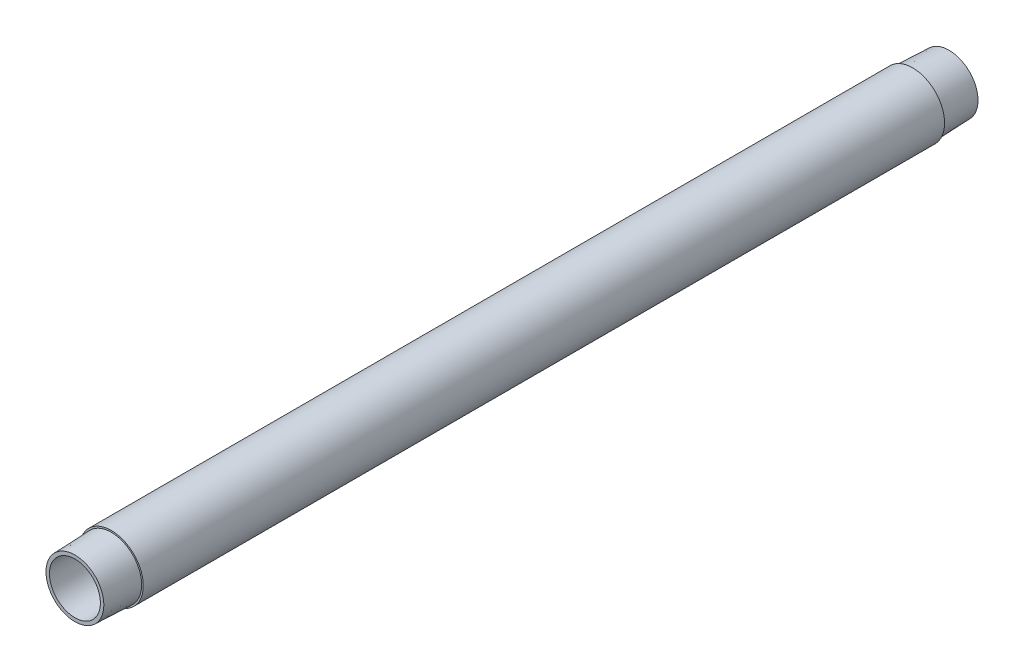
ISO-10303-21;
HEADER;
FILE_DESCRIPTION(('STEP AP214'),'2;1');
FILE_NAME('part.step','',(''),(''),'','','');
FILE_SCHEMA(('AUTOMOTIVE_DESIGN { 1 0 10303 214 1 1 1 1 }'));
ENDSEC;
DATA;
#1=APPLICATION_CONTEXT('core data for automotive mechanical design processes');
#2=APPLICATION_PROTOCOL_DEFINITION('international standard','automotive_design',2000,#1);
#3=PRODUCT_CONTEXT('',#1,'mechanical');
#4=PRODUCT('Part','Part','',(#3));
#5=PRODUCT_RELATED_PRODUCT_CATEGORY('part','',(#4));
#6=PRODUCT_DEFINITION_FORMATION('','',#4);
#7=PRODUCT_DEFINITION_CONTEXT('part definition',#1,'design');
#8=PRODUCT_DEFINITION('design','',#6,#7);
#9=PRODUCT_DEFINITION_SHAPE('','',#8);
#10=(LENGTH_UNIT() NAMED_UNIT(*) SI_UNIT(.MILLI.,.METRE.));
#11=(NAMED_UNIT(*) PLANE_ANGLE_UNIT() SI_UNIT($,.RADIAN.));
#12=(NAMED_UNIT(*) SI_UNIT($,.STERADIAN.) SOLID_ANGLE_UNIT());
#13=UNCERTAINTY_MEASURE_WITH_UNIT(LENGTH_MEASURE(1.E-05),#10,'distance_accuracy_value','');
#14=(GEOMETRIC_REPRESENTATION_CONTEXT(3) GLOBAL_UNCERTAINTY_ASSIGNED_CONTEXT((#13)) GLOBAL_UNIT_ASSIGNED_CONTEXT((#10,
#11,#12)) REPRESENTATION_CONTEXT('',''));
#15=CARTESIAN_POINT('',(0.,0.,0.));
#16=DIRECTION('',(0.,0.,1.));
#17=DIRECTION('',(1.,0.,0.));
#18=AXIS2_PLACEMENT_3D('',#15,#16,#17);
#19=CARTESIAN_POINT('',(0.,0.,457.2));
#20=DIRECTION('',(0.,0.,-1.));
#21=DIRECTION('',(-1.,0.,0.));
#22=AXIS2_PLACEMENT_3D('',#19,#20,#21);
#23=CYLINDRICAL_SURFACE('',#22,16.7005);
#24=CARTESIAN_POINT('',(0.,0.,19.05));
#25=DIRECTION('',(0.,0.,-1.));
#26=DIRECTION('',(0.,1.,0.));
#27=AXIS2_PLACEMENT_3D('',#24,#25,#26);
#28=CIRCLE('',#27,16.7005);
#29=CARTESIAN_POINT('',(0.,16.7005,19.05));
#30=VERTEX_POINT('',#29);
#31=EDGE_CURVE('E43',#30,#30,#28,.T.);
#32=ORIENTED_EDGE('',*,*,#31,.F.);
#33=EDGE_LOOP('',(#32));
#34=FACE_BOUND('',#33,.T.);
#35=CARTESIAN_POINT('',(0.,0.,438.15));
#36=DIRECTION('',(0.,0.,1.));
#37=DIRECTION('',(0.,-1.,0.));
#38=AXIS2_PLACEMENT_3D('',#35,#36,#37);
#39=CIRCLE('',#38,16.7005);
#40=CARTESIAN_POINT('',(0.,-16.7005,438.15));
#41=VERTEX_POINT('',#40);
#42=EDGE_CURVE('E34',#41,#41,#39,.T.);
#43=ORIENTED_EDGE('',*,*,#42,.F.);
#44=EDGE_LOOP('',(#43));
#45=FACE_BOUND('',#44,.T.);
#46=ADVANCED_FACE('F31',(#34,#45),#23,.T.);
#47=CARTESIAN_POINT('',(0.,0.,457.2));
#48=DIRECTION('',(0.,0.,1.));
#49=DIRECTION('',(1.,0.,0.));
#50=AXIS2_PLACEMENT_3D('',#47,#48,#49);
#51=PLANE('',#50);
#52=CARTESIAN_POINT('',(0.,0.,457.2));
#53=DIRECTION('',(0.,0.,1.));
#54=DIRECTION('',(1.,0.,0.));
#55=AXIS2_PLACEMENT_3D('',#52,#53,#54);
#56=CIRCLE('',#55,13.3223);
#57=CARTESIAN_POINT('',(13.3223,0.,457.2));
#58=VERTEX_POINT('',#57);
#59=EDGE_CURVE('E10',#58,#58,#56,.T.);
#60=ORIENTED_EDGE('',*,*,#59,.F.);
#61=EDGE_LOOP('',(#60));
#62=FACE_BOUND('',#61,.T.);
#63=CARTESIAN_POINT('',(0.,-1.44022644559732E-13,457.2));
#64=DIRECTION('',(0.,0.,1.));
#65=DIRECTION('',(0.,-1.,0.));
#66=AXIS2_PLACEMENT_3D('',#63,#64,#65);
#67=CIRCLE('',#66,15.1262084529018);
#68=CARTESIAN_POINT('',(0.,-15.126208452902,457.2));
#69=VERTEX_POINT('',#68);
#70=EDGE_CURVE('E59',#69,#69,#67,.T.);
#71=ORIENTED_EDGE('',*,*,#70,.T.);
#72=EDGE_LOOP('',(#71));
#73=FACE_BOUND('',#72,.T.);
#74=ADVANCED_FACE('F78',(#62,#73),#51,.T.);
#75=CARTESIAN_POINT('',(0.,0.,0.));
#76=DIRECTION('',(0.,0.,1.));
#77=DIRECTION('',(1.,0.,0.));
#78=AXIS2_PLACEMENT_3D('',#75,#76,#77);
#79=PLANE('',#78);
#80=CARTESIAN_POINT('',(0.,0.,0.));
#81=DIRECTION('',(0.,0.,1.));
#82=DIRECTION('',(1.,0.,0.));
#83=AXIS2_PLACEMENT_3D('',#80,#81,#82);
#84=CIRCLE('',#83,13.3223);
#85=CARTESIAN_POINT('',(13.3223,0.,0.));
#86=VERTEX_POINT('',#85);
#87=EDGE_CURVE('E38',#86,#86,#84,.T.);
#88=ORIENTED_EDGE('',*,*,#87,.T.);
#89=EDGE_LOOP('',(#88));
#90=FACE_BOUND('',#89,.T.);
#91=CARTESIAN_POINT('',(0.,0.,0.));
#92=DIRECTION('',(0.,0.,1.));
#93=DIRECTION('',(0.,-1.,0.));
#94=AXIS2_PLACEMENT_3D('',#91,#92,#93);
#95=CIRCLE('',#94,15.1262084529016);
#96=CARTESIAN_POINT('',(0.,-15.1262084529015,0.));
#97=VERTEX_POINT('',#96);
#98=EDGE_CURVE('E52',#97,#97,#95,.T.);
#99=ORIENTED_EDGE('',*,*,#98,.F.);
#100=EDGE_LOOP('',(#99));
#101=FACE_BOUND('',#100,.T.);
#102=ADVANCED_FACE('F83',(#90,#101),#79,.F.);
#103=CARTESIAN_POINT('',(0.,0.,457.2));
#104=DIRECTION('',(0.,0.,-1.));
#105=DIRECTION('',(-1.,0.,0.));
#106=AXIS2_PLACEMENT_3D('',#103,#104,#105);
#107=CYLINDRICAL_SURFACE('',#106,13.3223);
#108=ORIENTED_EDGE('',*,*,#59,.T.);
#109=EDGE_LOOP('',(#108));
#110=FACE_BOUND('',#109,.T.);
#111=ORIENTED_EDGE('',*,*,#87,.F.);
#112=EDGE_LOOP('',(#111));
#113=FACE_BOUND('',#112,.T.);
#114=ADVANCED_FACE('F89',(#110,#113),#107,.F.);
#115=CARTESIAN_POINT('',(0.,16.7005,19.05));
#116=DIRECTION('',(0.,0.,-1.));
#117=DIRECTION('',(0.,1.,0.));
#118=AXIS2_PLACEMENT_3D('',#115,#116,#117);
#119=PLANE('',#118);
#120=CARTESIAN_POINT('',(0.,0.,19.05));
#121=DIRECTION('',(0.,0.,1.));
#122=DIRECTION('',(0.,-1.,0.));
#123=AXIS2_PLACEMENT_3D('',#120,#121,#122);
#124=CIRCLE('',#123,15.8692502716406);
#125=CARTESIAN_POINT('',(0.,-15.8692502716406,19.05));
#126=VERTEX_POINT('',#125);
#127=EDGE_CURVE('E46',#126,#126,#124,.T.);
#128=ORIENTED_EDGE('',*,*,#127,.T.);
#129=EDGE_LOOP('',(#128));
#130=FACE_BOUND('',#129,.T.);
#131=ORIENTED_EDGE('',*,*,#31,.T.);
#132=EDGE_LOOP('',(#131));
#133=FACE_BOUND('',#132,.T.);
#134=ADVANCED_FACE('F95',(#130,#133),#119,.T.);
#135=CARTESIAN_POINT('',(0.,0.,19.05));
#136=DIRECTION('',(0.,0.,1.));
#137=DIRECTION('',(0.,-1.,0.));
#138=AXIS2_PLACEMENT_3D('',#135,#136,#137);
#139=CONICAL_SURFACE('',#138,15.8692502716406,0.0389850575857646);
#140=ORIENTED_EDGE('',*,*,#98,.T.);
#141=EDGE_LOOP('',(#140));
#142=FACE_BOUND('',#141,.T.);
#143=ORIENTED_EDGE('',*,*,#127,.F.);
#144=EDGE_LOOP('',(#143));
#145=FACE_BOUND('',#144,.T.);
#146=ADVANCED_FACE('F73',(#142,#145),#139,.T.);
#147=CARTESIAN_POINT('',(0.,16.7004999999999,438.15));
#148=DIRECTION('',(0.,0.,1.));
#149=DIRECTION('',(0.,-1.,0.));
#150=AXIS2_PLACEMENT_3D('',#147,#148,#149);
#151=PLANE('',#150);
#152=CARTESIAN_POINT('',(0.,-1.34044601568394E-13,438.15));
#153=DIRECTION('',(0.,0.,1.));
#154=DIRECTION('',(0.,-1.,0.));
#155=AXIS2_PLACEMENT_3D('',#152,#153,#154);
#156=CIRCLE('',#155,15.8692502716408);
#157=CARTESIAN_POINT('',(0.,-15.869250271641,438.15));
#158=VERTEX_POINT('',#157);
#159=EDGE_CURVE('E63',#158,#158,#156,.T.);
#160=ORIENTED_EDGE('',*,*,#159,.F.);
#161=EDGE_LOOP('',(#160));
#162=FACE_BOUND('',#161,.T.);
#163=ORIENTED_EDGE('',*,*,#42,.T.);
#164=EDGE_LOOP('',(#163));
#165=FACE_BOUND('',#164,.T.);
#166=ADVANCED_FACE('F70',(#162,#165),#151,.T.);
#167=CARTESIAN_POINT('',(0.,-1.44022644559732E-13,457.2));
#168=DIRECTION('',(0.,0.,-1.));
#169=DIRECTION('',(0.,1.,0.));
#170=AXIS2_PLACEMENT_3D('',#167,#168,#169);
#171=CONICAL_SURFACE('',#170,15.1262084529018,0.0389850575857604);
#172=ORIENTED_EDGE('',*,*,#159,.T.);
#173=EDGE_LOOP('',(#172));
#174=FACE_BOUND('',#173,.T.);
#175=ORIENTED_EDGE('',*,*,#70,.F.);
#176=EDGE_LOOP('',(#175));
#177=FACE_BOUND('',#176,.T.);
#178=ADVANCED_FACE('F67',(#174,#177),#171,.T.);
#179=CLOSED_SHELL('',(#46,#74,#102,#114,#134,#146,#166,#178));
#180=MANIFOLD_SOLID_BREP('B2',#179);
#181=ADVANCED_BREP_SHAPE_REPRESENTATION('',(#18,#180),#14);
#182=SHAPE_DEFINITION_REPRESENTATION(#9,#181);
ENDSEC;
END-ISO-10303-21;
